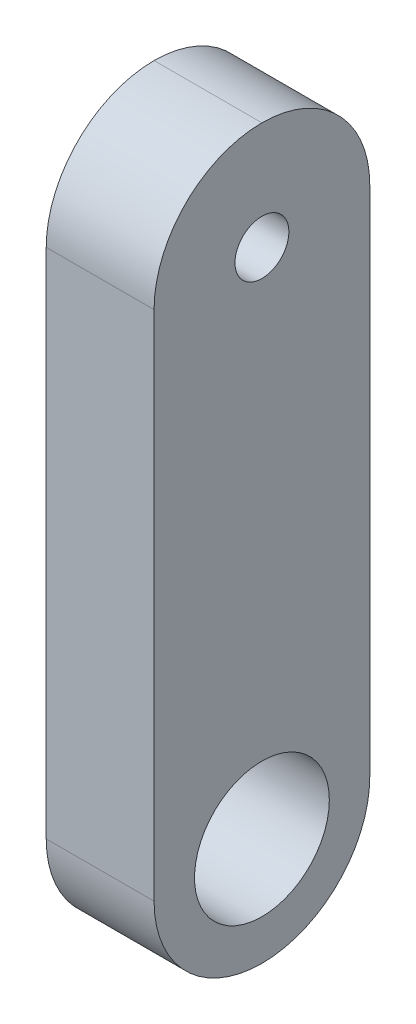
ISO-10303-21;
HEADER;
FILE_DESCRIPTION(('STEP AP214'),'2;1');
FILE_NAME('part.step','',(''),(''),'','','');
FILE_SCHEMA(('AUTOMOTIVE_DESIGN { 1 0 10303 214 1 1 1 1 }'));
ENDSEC;
DATA;
#1=APPLICATION_CONTEXT('core data for automotive mechanical design processes');
#2=APPLICATION_PROTOCOL_DEFINITION('international standard','automotive_design',2000,#1);
#3=PRODUCT_CONTEXT('',#1,'mechanical');
#4=PRODUCT('Part','Part','',(#3));
#5=PRODUCT_RELATED_PRODUCT_CATEGORY('part','',(#4));
#6=PRODUCT_DEFINITION_FORMATION('','',#4);
#7=PRODUCT_DEFINITION_CONTEXT('part definition',#1,'design');
#8=PRODUCT_DEFINITION('design','',#6,#7);
#9=PRODUCT_DEFINITION_SHAPE('','',#8);
#10=(LENGTH_UNIT() NAMED_UNIT(*) SI_UNIT(.MILLI.,.METRE.));
#11=(NAMED_UNIT(*) PLANE_ANGLE_UNIT() SI_UNIT($,.RADIAN.));
#12=(NAMED_UNIT(*) SI_UNIT($,.STERADIAN.) SOLID_ANGLE_UNIT());
#13=UNCERTAINTY_MEASURE_WITH_UNIT(LENGTH_MEASURE(1.E-05),#10,'distance_accuracy_value','');
#14=(GEOMETRIC_REPRESENTATION_CONTEXT(3) GLOBAL_UNCERTAINTY_ASSIGNED_CONTEXT((#13)) GLOBAL_UNIT_ASSIGNED_CONTEXT((#10,
#11,#12)) REPRESENTATION_CONTEXT('',''));
#15=CARTESIAN_POINT('',(0.,0.,0.));
#16=DIRECTION('',(0.,0.,1.));
#17=DIRECTION('',(1.,0.,0.));
#18=AXIS2_PLACEMENT_3D('',#15,#16,#17);
#19=CARTESIAN_POINT('',(4.,0.,0.));
#20=DIRECTION('',(0.,0.,-1.));
#21=DIRECTION('',(0.,1.,0.));
#22=AXIS2_PLACEMENT_3D('',#19,#20,#21);
#23=PLANE('',#22);
#24=DIRECTION('',(0.,-1.,0.));
#25=VECTOR('',#24,1.);
#26=CARTESIAN_POINT('',(0.,0.,0.));
#27=LINE('',#26,#25);
#28=CARTESIAN_POINT('',(0.,-4.,0.));
#29=VERTEX_POINT('',#28);
#30=CARTESIAN_POINT('',(0.,-23.,0.));
#31=VERTEX_POINT('',#30);
#32=EDGE_CURVE('E112',#29,#31,#27,.T.);
#33=ORIENTED_EDGE('',*,*,#32,.T.);
#34=DIRECTION('',(-1.,0.,0.));
#35=VECTOR('',#34,1.);
#36=CARTESIAN_POINT('',(4.,-23.,0.));
#37=LINE('',#36,#35);
#38=CARTESIAN_POINT('',(4.,-23.,0.));
#39=VERTEX_POINT('',#38);
#40=EDGE_CURVE('E11',#31,#39,#37,.F.);
#41=ORIENTED_EDGE('',*,*,#40,.T.);
#42=DIRECTION('',(0.,-1.,0.));
#43=VECTOR('',#42,1.);
#44=CARTESIAN_POINT('',(4.,0.,0.));
#45=LINE('',#44,#43);
#46=CARTESIAN_POINT('',(4.,-4.,0.));
#47=VERTEX_POINT('',#46);
#48=EDGE_CURVE('E111',#47,#39,#45,.T.);
#49=ORIENTED_EDGE('',*,*,#48,.F.);
#50=DIRECTION('',(-1.,0.,0.));
#51=VECTOR('',#50,1.);
#52=CARTESIAN_POINT('',(4.,-4.,0.));
#53=LINE('',#52,#51);
#54=EDGE_CURVE('E42',#47,#29,#53,.T.);
#55=ORIENTED_EDGE('',*,*,#54,.T.);
#56=EDGE_LOOP('',(#33,#41,#49,#55));
#57=FACE_BOUND('',#56,.T.);
#58=ADVANCED_FACE('F33',(#57),#23,.F.);
#59=CARTESIAN_POINT('',(4.,0.,-8.));
#60=DIRECTION('',(0.,0.,1.));
#61=DIRECTION('',(0.,-1.,0.));
#62=AXIS2_PLACEMENT_3D('',#59,#60,#61);
#63=PLANE('',#62);
#64=DIRECTION('',(0.,1.,0.));
#65=VECTOR('',#64,1.);
#66=CARTESIAN_POINT('',(4.,0.,-8.));
#67=LINE('',#66,#65);
#68=CARTESIAN_POINT('',(4.,-23.,-8.));
#69=VERTEX_POINT('',#68);
#70=CARTESIAN_POINT('',(4.,-4.,-8.));
#71=VERTEX_POINT('',#70);
#72=EDGE_CURVE('E105',#69,#71,#67,.T.);
#73=ORIENTED_EDGE('',*,*,#72,.F.);
#74=DIRECTION('',(-1.,0.,0.));
#75=VECTOR('',#74,1.);
#76=CARTESIAN_POINT('',(4.,-23.,-8.));
#77=LINE('',#76,#75);
#78=CARTESIAN_POINT('',(0.,-23.,-8.));
#79=VERTEX_POINT('',#78);
#80=EDGE_CURVE('E92',#69,#79,#77,.T.);
#81=ORIENTED_EDGE('',*,*,#80,.T.);
#82=DIRECTION('',(0.,1.,0.));
#83=VECTOR('',#82,1.);
#84=CARTESIAN_POINT('',(0.,0.,-8.));
#85=LINE('',#84,#83);
#86=CARTESIAN_POINT('',(0.,-4.,-8.));
#87=VERTEX_POINT('',#86);
#88=EDGE_CURVE('E103',#79,#87,#85,.T.);
#89=ORIENTED_EDGE('',*,*,#88,.T.);
#90=DIRECTION('',(-1.,0.,0.));
#91=VECTOR('',#90,1.);
#92=CARTESIAN_POINT('',(4.,-4.,-8.));
#93=LINE('',#92,#91);
#94=EDGE_CURVE('E107',#87,#71,#93,.F.);
#95=ORIENTED_EDGE('',*,*,#94,.T.);
#96=EDGE_LOOP('',(#73,#81,#89,#95));
#97=FACE_BOUND('',#96,.T.);
#98=ADVANCED_FACE('F102',(#97),#63,.F.);
#99=CARTESIAN_POINT('',(4.,0.,0.));
#100=DIRECTION('',(1.,0.,0.));
#101=DIRECTION('',(0.,0.,-1.));
#102=AXIS2_PLACEMENT_3D('',#99,#100,#101);
#103=PLANE('',#102);
#104=CARTESIAN_POINT('',(4.,-4.,-4.));
#105=DIRECTION('',(1.,0.,0.));
#106=DIRECTION('',(0.,0.,-1.));
#107=AXIS2_PLACEMENT_3D('',#104,#105,#106);
#108=CIRCLE('',#107,1.);
#109=CARTESIAN_POINT('',(4.,-4.,-5.));
#110=VERTEX_POINT('',#109);
#111=EDGE_CURVE('E132',#110,#110,#108,.T.);
#112=ORIENTED_EDGE('',*,*,#111,.F.);
#113=EDGE_LOOP('',(#112));
#114=FACE_BOUND('',#113,.T.);
#115=CARTESIAN_POINT('',(4.,-23.,-4.));
#116=DIRECTION('',(1.,0.,0.));
#117=DIRECTION('',(0.,0.,-1.));
#118=AXIS2_PLACEMENT_3D('',#115,#116,#117);
#119=CIRCLE('',#118,2.5);
#120=CARTESIAN_POINT('',(4.,-23.,-6.5));
#121=VERTEX_POINT('',#120);
#122=EDGE_CURVE('E144',#121,#121,#119,.T.);
#123=ORIENTED_EDGE('',*,*,#122,.F.);
#124=EDGE_LOOP('',(#123));
#125=FACE_BOUND('',#124,.T.);
#126=CARTESIAN_POINT('',(4.,-23.,-4.));
#127=DIRECTION('',(1.,0.,0.));
#128=DIRECTION('',(0.,0.,-1.));
#129=AXIS2_PLACEMENT_3D('',#126,#127,#128);
#130=CIRCLE('',#129,4.);
#131=CARTESIAN_POINT('',(4.,-27.,-4.));
#132=VERTEX_POINT('',#131);
#133=EDGE_CURVE('E57',#39,#132,#130,.T.);
#134=ORIENTED_EDGE('',*,*,#133,.T.);
#135=CARTESIAN_POINT('',(4.,-23.,-4.));
#136=DIRECTION('',(1.,0.,0.));
#137=DIRECTION('',(0.,0.,-1.));
#138=AXIS2_PLACEMENT_3D('',#135,#136,#137);
#139=CIRCLE('',#138,4.);
#140=EDGE_CURVE('E129',#132,#69,#139,.T.);
#141=ORIENTED_EDGE('',*,*,#140,.T.);
#142=ORIENTED_EDGE('',*,*,#72,.T.);
#143=CARTESIAN_POINT('',(4.,-4.,-4.));
#144=DIRECTION('',(1.,0.,0.));
#145=DIRECTION('',(0.,0.,-1.));
#146=AXIS2_PLACEMENT_3D('',#143,#144,#145);
#147=CIRCLE('',#146,4.);
#148=CARTESIAN_POINT('',(4.,0.,-4.));
#149=VERTEX_POINT('',#148);
#150=EDGE_CURVE('E50',#71,#149,#147,.T.);
#151=ORIENTED_EDGE('',*,*,#150,.T.);
#152=CARTESIAN_POINT('',(4.,-4.,-4.));
#153=DIRECTION('',(1.,0.,0.));
#154=DIRECTION('',(0.,0.,-1.));
#155=AXIS2_PLACEMENT_3D('',#152,#153,#154);
#156=CIRCLE('',#155,4.);
#157=EDGE_CURVE('E126',#149,#47,#156,.T.);
#158=ORIENTED_EDGE('',*,*,#157,.T.);
#159=ORIENTED_EDGE('',*,*,#48,.T.);
#160=EDGE_LOOP('',(#134,#141,#142,#151,#158,#159));
#161=FACE_BOUND('',#160,.T.);
#162=ADVANCED_FACE('F142',(#114,#125,#161),#103,.T.);
#163=CARTESIAN_POINT('',(0.,0.,0.));
#164=DIRECTION('',(1.,0.,0.));
#165=DIRECTION('',(0.,0.,-1.));
#166=AXIS2_PLACEMENT_3D('',#163,#164,#165);
#167=PLANE('',#166);
#168=CARTESIAN_POINT('',(0.,-4.,-4.));
#169=DIRECTION('',(1.,0.,0.));
#170=DIRECTION('',(0.,0.,-1.));
#171=AXIS2_PLACEMENT_3D('',#168,#169,#170);
#172=CIRCLE('',#171,1.);
#173=CARTESIAN_POINT('',(0.,-4.,-5.));
#174=VERTEX_POINT('',#173);
#175=EDGE_CURVE('E134',#174,#174,#172,.T.);
#176=ORIENTED_EDGE('',*,*,#175,.T.);
#177=EDGE_LOOP('',(#176));
#178=FACE_BOUND('',#177,.T.);
#179=CARTESIAN_POINT('',(0.,-23.,-4.));
#180=DIRECTION('',(1.,0.,0.));
#181=DIRECTION('',(0.,0.,-1.));
#182=AXIS2_PLACEMENT_3D('',#179,#180,#181);
#183=CIRCLE('',#182,2.5);
#184=CARTESIAN_POINT('',(0.,-23.,-6.5));
#185=VERTEX_POINT('',#184);
#186=EDGE_CURVE('E116',#185,#185,#183,.T.);
#187=ORIENTED_EDGE('',*,*,#186,.T.);
#188=EDGE_LOOP('',(#187));
#189=FACE_BOUND('',#188,.T.);
#190=ORIENTED_EDGE('',*,*,#88,.F.);
#191=CARTESIAN_POINT('',(0.,-23.,-4.));
#192=DIRECTION('',(1.,0.,0.));
#193=DIRECTION('',(0.,0.,-1.));
#194=AXIS2_PLACEMENT_3D('',#191,#192,#193);
#195=CIRCLE('',#194,4.);
#196=CARTESIAN_POINT('',(0.,-27.,-4.));
#197=VERTEX_POINT('',#196);
#198=EDGE_CURVE('E88',#79,#197,#195,.F.);
#199=ORIENTED_EDGE('',*,*,#198,.T.);
#200=CARTESIAN_POINT('',(0.,-23.,-4.));
#201=DIRECTION('',(1.,0.,0.));
#202=DIRECTION('',(0.,0.,-1.));
#203=AXIS2_PLACEMENT_3D('',#200,#201,#202);
#204=CIRCLE('',#203,4.);
#205=EDGE_CURVE('E97',#197,#31,#204,.F.);
#206=ORIENTED_EDGE('',*,*,#205,.T.);
#207=ORIENTED_EDGE('',*,*,#32,.F.);
#208=CARTESIAN_POINT('',(0.,-4.,-4.));
#209=DIRECTION('',(1.,0.,0.));
#210=DIRECTION('',(0.,0.,-1.));
#211=AXIS2_PLACEMENT_3D('',#208,#209,#210);
#212=CIRCLE('',#211,4.);
#213=CARTESIAN_POINT('',(0.,0.,-4.));
#214=VERTEX_POINT('',#213);
#215=EDGE_CURVE('E122',#29,#214,#212,.F.);
#216=ORIENTED_EDGE('',*,*,#215,.T.);
#217=CARTESIAN_POINT('',(0.,-4.,-4.));
#218=DIRECTION('',(1.,0.,0.));
#219=DIRECTION('',(0.,0.,-1.));
#220=AXIS2_PLACEMENT_3D('',#217,#218,#219);
#221=CIRCLE('',#220,4.);
#222=EDGE_CURVE('E106',#214,#87,#221,.F.);
#223=ORIENTED_EDGE('',*,*,#222,.T.);
#224=EDGE_LOOP('',(#190,#199,#206,#207,#216,#223));
#225=FACE_BOUND('',#224,.T.);
#226=ADVANCED_FACE('F109',(#178,#189,#225),#167,.F.);
#227=CARTESIAN_POINT('',(0.,-23.,-4.));
#228=DIRECTION('',(1.,0.,0.));
#229=DIRECTION('',(0.,0.,-1.));
#230=AXIS2_PLACEMENT_3D('',#227,#228,#229);
#231=CYLINDRICAL_SURFACE('',#230,2.5);
#232=ORIENTED_EDGE('',*,*,#186,.F.);
#233=EDGE_LOOP('',(#232));
#234=FACE_BOUND('',#233,.T.);
#235=ORIENTED_EDGE('',*,*,#122,.T.);
#236=EDGE_LOOP('',(#235));
#237=FACE_BOUND('',#236,.T.);
#238=ADVANCED_FACE('F158',(#234,#237),#231,.F.);
#239=CARTESIAN_POINT('',(0.,-4.,-4.));
#240=DIRECTION('',(1.,0.,0.));
#241=DIRECTION('',(0.,0.,-1.));
#242=AXIS2_PLACEMENT_3D('',#239,#240,#241);
#243=CYLINDRICAL_SURFACE('',#242,1.);
#244=ORIENTED_EDGE('',*,*,#175,.F.);
#245=EDGE_LOOP('',(#244));
#246=FACE_BOUND('',#245,.T.);
#247=ORIENTED_EDGE('',*,*,#111,.T.);
#248=EDGE_LOOP('',(#247));
#249=FACE_BOUND('',#248,.T.);
#250=ADVANCED_FACE('F154',(#246,#249),#243,.F.);
#251=CARTESIAN_POINT('',(4.,-23.,-4.));
#252=DIRECTION('',(-1.,0.,0.));
#253=DIRECTION('',(0.,0.,1.));
#254=AXIS2_PLACEMENT_3D('',#251,#252,#253);
#255=CYLINDRICAL_SURFACE('',#254,4.);
#256=DIRECTION('',(-1.,0.,0.));
#257=VECTOR('',#256,1.);
#258=CARTESIAN_POINT('',(4.,-27.,-4.));
#259=LINE('',#258,#257);
#260=EDGE_CURVE('E93',#132,#197,#259,.T.);
#261=ORIENTED_EDGE('',*,*,#260,.F.);
#262=ORIENTED_EDGE('',*,*,#133,.F.);
#263=ORIENTED_EDGE('',*,*,#40,.F.);
#264=ORIENTED_EDGE('',*,*,#205,.F.);
#265=EDGE_LOOP('',(#261,#262,#263,#264));
#266=FACE_BOUND('',#265,.T.);
#267=ADVANCED_FACE('F157',(#266),#255,.T.);
#268=CARTESIAN_POINT('',(4.,-23.,-4.));
#269=DIRECTION('',(-1.,0.,0.));
#270=DIRECTION('',(0.,0.,1.));
#271=AXIS2_PLACEMENT_3D('',#268,#269,#270);
#272=CYLINDRICAL_SURFACE('',#271,4.);
#273=ORIENTED_EDGE('',*,*,#140,.F.);
#274=ORIENTED_EDGE('',*,*,#260,.T.);
#275=ORIENTED_EDGE('',*,*,#198,.F.);
#276=ORIENTED_EDGE('',*,*,#80,.F.);
#277=EDGE_LOOP('',(#273,#274,#275,#276));
#278=FACE_BOUND('',#277,.T.);
#279=ADVANCED_FACE('F91',(#278),#272,.T.);
#280=CARTESIAN_POINT('',(4.,-4.,-4.));
#281=DIRECTION('',(-1.,0.,0.));
#282=DIRECTION('',(0.,0.,1.));
#283=AXIS2_PLACEMENT_3D('',#280,#281,#282);
#284=CYLINDRICAL_SURFACE('',#283,4.);
#285=DIRECTION('',(-1.,0.,0.));
#286=VECTOR('',#285,1.);
#287=CARTESIAN_POINT('',(4.,0.,-4.));
#288=LINE('',#287,#286);
#289=EDGE_CURVE('E37',#149,#214,#288,.T.);
#290=ORIENTED_EDGE('',*,*,#289,.F.);
#291=ORIENTED_EDGE('',*,*,#150,.F.);
#292=ORIENTED_EDGE('',*,*,#94,.F.);
#293=ORIENTED_EDGE('',*,*,#222,.F.);
#294=EDGE_LOOP('',(#290,#291,#292,#293));
#295=FACE_BOUND('',#294,.T.);
#296=ADVANCED_FACE('F35',(#295),#284,.T.);
#297=CARTESIAN_POINT('',(4.,-4.,-4.));
#298=DIRECTION('',(-1.,0.,0.));
#299=DIRECTION('',(0.,0.,1.));
#300=AXIS2_PLACEMENT_3D('',#297,#298,#299);
#301=CYLINDRICAL_SURFACE('',#300,4.);
#302=ORIENTED_EDGE('',*,*,#157,.F.);
#303=ORIENTED_EDGE('',*,*,#289,.T.);
#304=ORIENTED_EDGE('',*,*,#215,.F.);
#305=ORIENTED_EDGE('',*,*,#54,.F.);
#306=EDGE_LOOP('',(#302,#303,#304,#305));
#307=FACE_BOUND('',#306,.T.);
#308=ADVANCED_FACE('F139',(#307),#301,.T.);
#309=CLOSED_SHELL('',(#58,#98,#162,#226,#238,#250,#267,#279,#296,#308));
#310=MANIFOLD_SOLID_BREP('B2',#309);
#311=ADVANCED_BREP_SHAPE_REPRESENTATION('',(#18,#310),#14);
#312=SHAPE_DEFINITION_REPRESENTATION(#9,#311);
ENDSEC;
END-ISO-10303-21;
